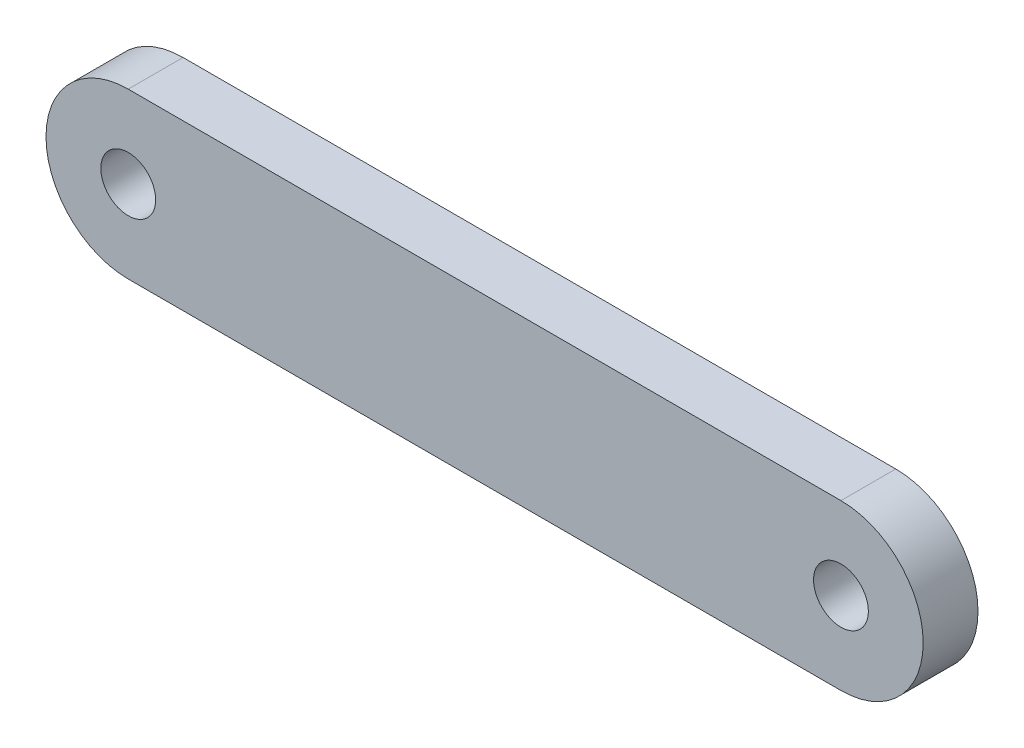
ISO-10303-21;
HEADER;
FILE_DESCRIPTION(('STEP AP214'),'2;1');
FILE_NAME('part.step','',(''),(''),'','','');
FILE_SCHEMA(('AUTOMOTIVE_DESIGN { 1 0 10303 214 1 1 1 1 }'));
ENDSEC;
DATA;
#1=APPLICATION_CONTEXT('core data for automotive mechanical design processes');
#2=APPLICATION_PROTOCOL_DEFINITION('international standard','automotive_design',2000,#1);
#3=PRODUCT_CONTEXT('',#1,'mechanical');
#4=PRODUCT('Part','Part','',(#3));
#5=PRODUCT_RELATED_PRODUCT_CATEGORY('part','',(#4));
#6=PRODUCT_DEFINITION_FORMATION('','',#4);
#7=PRODUCT_DEFINITION_CONTEXT('part definition',#1,'design');
#8=PRODUCT_DEFINITION('design','',#6,#7);
#9=PRODUCT_DEFINITION_SHAPE('','',#8);
#10=(LENGTH_UNIT() NAMED_UNIT(*) SI_UNIT(.MILLI.,.METRE.));
#11=(NAMED_UNIT(*) PLANE_ANGLE_UNIT() SI_UNIT($,.RADIAN.));
#12=(NAMED_UNIT(*) SI_UNIT($,.STERADIAN.) SOLID_ANGLE_UNIT());
#13=UNCERTAINTY_MEASURE_WITH_UNIT(LENGTH_MEASURE(1.E-05),#10,'distance_accuracy_value','');
#14=(GEOMETRIC_REPRESENTATION_CONTEXT(3) GLOBAL_UNCERTAINTY_ASSIGNED_CONTEXT((#13)) GLOBAL_UNIT_ASSIGNED_CONTEXT((#10,
#11,#12)) REPRESENTATION_CONTEXT('',''));
#15=CARTESIAN_POINT('',(0.,0.,0.));
#16=DIRECTION('',(0.,0.,1.));
#17=DIRECTION('',(1.,0.,0.));
#18=AXIS2_PLACEMENT_3D('',#15,#16,#17);
#19=CARTESIAN_POINT('',(-65.,0.,10.));
#20=DIRECTION('',(0.,0.,1.));
#21=DIRECTION('',(1.,0.,0.));
#22=AXIS2_PLACEMENT_3D('',#19,#20,#21);
#23=PLANE('',#22);
#24=CARTESIAN_POINT('',(-65.,0.,10.));
#25=DIRECTION('',(0.,0.,1.));
#26=DIRECTION('',(1.,0.,0.));
#27=AXIS2_PLACEMENT_3D('',#24,#25,#26);
#28=CIRCLE('',#27,5.);
#29=CARTESIAN_POINT('',(-60.,0.,10.));
#30=VERTEX_POINT('',#29);
#31=EDGE_CURVE('E114',#30,#30,#28,.T.);
#32=ORIENTED_EDGE('',*,*,#31,.F.);
#33=EDGE_LOOP('',(#32));
#34=FACE_BOUND('',#33,.T.);
#35=CARTESIAN_POINT('',(-65.,0.,10.));
#36=DIRECTION('',(0.,0.,1.));
#37=DIRECTION('',(1.,0.,0.));
#38=AXIS2_PLACEMENT_3D('',#35,#36,#37);
#39=CIRCLE('',#38,15.);
#40=CARTESIAN_POINT('',(-65.,15.,10.));
#41=VERTEX_POINT('',#40);
#42=CARTESIAN_POINT('',(-65.,-15.,10.));
#43=VERTEX_POINT('',#42);
#44=EDGE_CURVE('E94',#41,#43,#39,.T.);
#45=ORIENTED_EDGE('',*,*,#44,.T.);
#46=DIRECTION('',(1.,0.,0.));
#47=VECTOR('',#46,1.);
#48=CARTESIAN_POINT('',(-65.,-15.,10.));
#49=LINE('',#48,#47);
#50=CARTESIAN_POINT('',(65.,-15.,10.));
#51=VERTEX_POINT('',#50);
#52=EDGE_CURVE('E89',#43,#51,#49,.T.);
#53=ORIENTED_EDGE('',*,*,#52,.T.);
#54=CARTESIAN_POINT('',(65.,0.,10.));
#55=DIRECTION('',(0.,0.,1.));
#56=DIRECTION('',(1.,0.,0.));
#57=AXIS2_PLACEMENT_3D('',#54,#55,#56);
#58=CIRCLE('',#57,15.);
#59=CARTESIAN_POINT('',(65.,15.,10.));
#60=VERTEX_POINT('',#59);
#61=EDGE_CURVE('E92',#51,#60,#58,.T.);
#62=ORIENTED_EDGE('',*,*,#61,.T.);
#63=DIRECTION('',(-1.,0.,0.));
#64=VECTOR('',#63,1.);
#65=CARTESIAN_POINT('',(-65.,15.,10.));
#66=LINE('',#65,#64);
#67=EDGE_CURVE('E59',#60,#41,#66,.T.);
#68=ORIENTED_EDGE('',*,*,#67,.T.);
#69=EDGE_LOOP('',(#45,#53,#62,#68));
#70=FACE_BOUND('',#69,.T.);
#71=CARTESIAN_POINT('',(65.,0.,10.));
#72=DIRECTION('',(0.,0.,1.));
#73=DIRECTION('',(1.,0.,0.));
#74=AXIS2_PLACEMENT_3D('',#71,#72,#73);
#75=CIRCLE('',#74,5.);
#76=CARTESIAN_POINT('',(70.,0.,10.));
#77=VERTEX_POINT('',#76);
#78=EDGE_CURVE('E136',#77,#77,#75,.T.);
#79=ORIENTED_EDGE('',*,*,#78,.F.);
#80=EDGE_LOOP('',(#79));
#81=FACE_BOUND('',#80,.T.);
#82=ADVANCED_FACE('F41',(#34,#70,#81),#23,.T.);
#83=CARTESIAN_POINT('',(-65.,0.,0.));
#84=DIRECTION('',(0.,0.,1.));
#85=DIRECTION('',(1.,0.,0.));
#86=AXIS2_PLACEMENT_3D('',#83,#84,#85);
#87=PLANE('',#86);
#88=CARTESIAN_POINT('',(-65.,0.,0.));
#89=DIRECTION('',(0.,0.,1.));
#90=DIRECTION('',(1.,0.,0.));
#91=AXIS2_PLACEMENT_3D('',#88,#89,#90);
#92=CIRCLE('',#91,15.);
#93=CARTESIAN_POINT('',(-65.,15.,0.));
#94=VERTEX_POINT('',#93);
#95=CARTESIAN_POINT('',(-65.,-15.,0.));
#96=VERTEX_POINT('',#95);
#97=EDGE_CURVE('E110',#94,#96,#92,.T.);
#98=ORIENTED_EDGE('',*,*,#97,.F.);
#99=DIRECTION('',(-1.,0.,0.));
#100=VECTOR('',#99,1.);
#101=CARTESIAN_POINT('',(-65.,15.,0.));
#102=LINE('',#101,#100);
#103=CARTESIAN_POINT('',(65.,15.,0.));
#104=VERTEX_POINT('',#103);
#105=EDGE_CURVE('E82',#104,#94,#102,.T.);
#106=ORIENTED_EDGE('',*,*,#105,.F.);
#107=CARTESIAN_POINT('',(65.,0.,0.));
#108=DIRECTION('',(0.,0.,1.));
#109=DIRECTION('',(1.,0.,0.));
#110=AXIS2_PLACEMENT_3D('',#107,#108,#109);
#111=CIRCLE('',#110,15.);
#112=CARTESIAN_POINT('',(65.,-15.,0.));
#113=VERTEX_POINT('',#112);
#114=EDGE_CURVE('E76',#113,#104,#111,.T.);
#115=ORIENTED_EDGE('',*,*,#114,.F.);
#116=DIRECTION('',(1.,0.,0.));
#117=VECTOR('',#116,1.);
#118=CARTESIAN_POINT('',(-65.,-15.,0.));
#119=LINE('',#118,#117);
#120=EDGE_CURVE('E99',#96,#113,#119,.T.);
#121=ORIENTED_EDGE('',*,*,#120,.F.);
#122=EDGE_LOOP('',(#98,#106,#115,#121));
#123=FACE_BOUND('',#122,.T.);
#124=CARTESIAN_POINT('',(-65.,0.,0.));
#125=DIRECTION('',(0.,0.,1.));
#126=DIRECTION('',(1.,0.,0.));
#127=AXIS2_PLACEMENT_3D('',#124,#125,#126);
#128=CIRCLE('',#127,5.);
#129=CARTESIAN_POINT('',(-60.,0.,0.));
#130=VERTEX_POINT('',#129);
#131=EDGE_CURVE('E132',#130,#130,#128,.T.);
#132=ORIENTED_EDGE('',*,*,#131,.T.);
#133=EDGE_LOOP('',(#132));
#134=FACE_BOUND('',#133,.T.);
#135=CARTESIAN_POINT('',(65.,0.,0.));
#136=DIRECTION('',(0.,0.,1.));
#137=DIRECTION('',(1.,0.,0.));
#138=AXIS2_PLACEMENT_3D('',#135,#136,#137);
#139=CIRCLE('',#138,5.);
#140=CARTESIAN_POINT('',(70.,0.,0.));
#141=VERTEX_POINT('',#140);
#142=EDGE_CURVE('E140',#141,#141,#139,.T.);
#143=ORIENTED_EDGE('',*,*,#142,.T.);
#144=EDGE_LOOP('',(#143));
#145=FACE_BOUND('',#144,.T.);
#146=ADVANCED_FACE('F127',(#123,#134,#145),#87,.F.);
#147=CARTESIAN_POINT('',(-65.,0.,10.));
#148=DIRECTION('',(0.,0.,-1.));
#149=DIRECTION('',(-1.,0.,0.));
#150=AXIS2_PLACEMENT_3D('',#147,#148,#149);
#151=CYLINDRICAL_SURFACE('',#150,15.);
#152=ORIENTED_EDGE('',*,*,#97,.T.);
#153=DIRECTION('',(0.,0.,-1.));
#154=VECTOR('',#153,1.);
#155=CARTESIAN_POINT('',(-65.,-15.,10.));
#156=LINE('',#155,#154);
#157=EDGE_CURVE('E11',#43,#96,#156,.T.);
#158=ORIENTED_EDGE('',*,*,#157,.F.);
#159=ORIENTED_EDGE('',*,*,#44,.F.);
#160=DIRECTION('',(0.,0.,-1.));
#161=VECTOR('',#160,1.);
#162=CARTESIAN_POINT('',(-65.,15.,10.));
#163=LINE('',#162,#161);
#164=EDGE_CURVE('E106',#41,#94,#163,.T.);
#165=ORIENTED_EDGE('',*,*,#164,.T.);
#166=EDGE_LOOP('',(#152,#158,#159,#165));
#167=FACE_BOUND('',#166,.T.);
#168=ADVANCED_FACE('F43',(#167),#151,.T.);
#169=CARTESIAN_POINT('',(-65.,-15.,10.));
#170=DIRECTION('',(0.,1.,0.));
#171=DIRECTION('',(0.,0.,1.));
#172=AXIS2_PLACEMENT_3D('',#169,#170,#171);
#173=PLANE('',#172);
#174=ORIENTED_EDGE('',*,*,#120,.T.);
#175=DIRECTION('',(0.,0.,-1.));
#176=VECTOR('',#175,1.);
#177=CARTESIAN_POINT('',(65.,-15.,10.));
#178=LINE('',#177,#176);
#179=EDGE_CURVE('E51',#51,#113,#178,.T.);
#180=ORIENTED_EDGE('',*,*,#179,.F.);
#181=ORIENTED_EDGE('',*,*,#52,.F.);
#182=ORIENTED_EDGE('',*,*,#157,.T.);
#183=EDGE_LOOP('',(#174,#180,#181,#182));
#184=FACE_BOUND('',#183,.T.);
#185=ADVANCED_FACE('F98',(#184),#173,.F.);
#186=CARTESIAN_POINT('',(65.,0.,10.));
#187=DIRECTION('',(0.,0.,-1.));
#188=DIRECTION('',(-1.,0.,0.));
#189=AXIS2_PLACEMENT_3D('',#186,#187,#188);
#190=CYLINDRICAL_SURFACE('',#189,15.);
#191=ORIENTED_EDGE('',*,*,#114,.T.);
#192=DIRECTION('',(0.,0.,-1.));
#193=VECTOR('',#192,1.);
#194=CARTESIAN_POINT('',(65.,15.,10.));
#195=LINE('',#194,#193);
#196=EDGE_CURVE('E101',#60,#104,#195,.T.);
#197=ORIENTED_EDGE('',*,*,#196,.F.);
#198=ORIENTED_EDGE('',*,*,#61,.F.);
#199=ORIENTED_EDGE('',*,*,#179,.T.);
#200=EDGE_LOOP('',(#191,#197,#198,#199));
#201=FACE_BOUND('',#200,.T.);
#202=ADVANCED_FACE('F102',(#201),#190,.T.);
#203=CARTESIAN_POINT('',(-65.,15.,10.));
#204=DIRECTION('',(0.,-1.,0.));
#205=DIRECTION('',(0.,0.,-1.));
#206=AXIS2_PLACEMENT_3D('',#203,#204,#205);
#207=PLANE('',#206);
#208=ORIENTED_EDGE('',*,*,#105,.T.);
#209=ORIENTED_EDGE('',*,*,#164,.F.);
#210=ORIENTED_EDGE('',*,*,#67,.F.);
#211=ORIENTED_EDGE('',*,*,#196,.T.);
#212=EDGE_LOOP('',(#208,#209,#210,#211));
#213=FACE_BOUND('',#212,.T.);
#214=ADVANCED_FACE('F124',(#213),#207,.F.);
#215=CARTESIAN_POINT('',(-65.,0.,10.));
#216=DIRECTION('',(0.,0.,-1.));
#217=DIRECTION('',(-1.,0.,0.));
#218=AXIS2_PLACEMENT_3D('',#215,#216,#217);
#219=CYLINDRICAL_SURFACE('',#218,5.);
#220=ORIENTED_EDGE('',*,*,#31,.T.);
#221=EDGE_LOOP('',(#220));
#222=FACE_BOUND('',#221,.T.);
#223=ORIENTED_EDGE('',*,*,#131,.F.);
#224=EDGE_LOOP('',(#223));
#225=FACE_BOUND('',#224,.T.);
#226=ADVANCED_FACE('F159',(#222,#225),#219,.F.);
#227=CARTESIAN_POINT('',(65.,0.,10.));
#228=DIRECTION('',(0.,0.,-1.));
#229=DIRECTION('',(-1.,0.,0.));
#230=AXIS2_PLACEMENT_3D('',#227,#228,#229);
#231=CYLINDRICAL_SURFACE('',#230,5.);
#232=ORIENTED_EDGE('',*,*,#78,.T.);
#233=EDGE_LOOP('',(#232));
#234=FACE_BOUND('',#233,.T.);
#235=ORIENTED_EDGE('',*,*,#142,.F.);
#236=EDGE_LOOP('',(#235));
#237=FACE_BOUND('',#236,.T.);
#238=ADVANCED_FACE('F148',(#234,#237),#231,.F.);
#239=CLOSED_SHELL('',(#82,#146,#168,#185,#202,#214,#226,#238));
#240=MANIFOLD_SOLID_BREP('B2',#239);
#241=ADVANCED_BREP_SHAPE_REPRESENTATION('',(#18,#240),#14);
#242=SHAPE_DEFINITION_REPRESENTATION(#9,#241);
ENDSEC;
END-ISO-10303-21;
